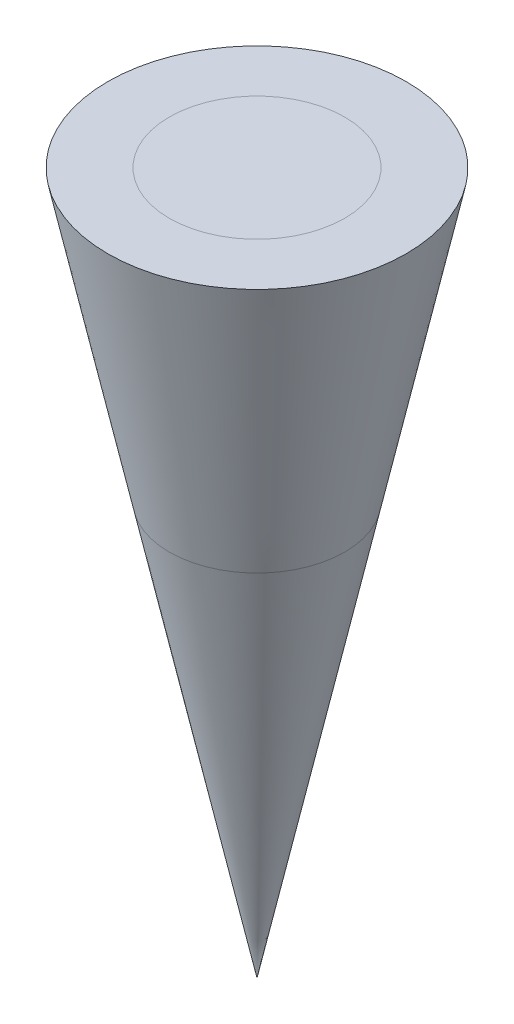
ISO-10303-21;
HEADER;
FILE_DESCRIPTION(('STEP AP214'),'2;1');
FILE_NAME('part.step','',(''),(''),'','','');
FILE_SCHEMA(('AUTOMOTIVE_DESIGN { 1 0 10303 214 1 1 1 1 }'));
ENDSEC;
DATA;
#1=APPLICATION_CONTEXT('core data for automotive mechanical design processes');
#2=APPLICATION_PROTOCOL_DEFINITION('international standard','automotive_design',2000,#1);
#3=PRODUCT_CONTEXT('',#1,'mechanical');
#4=PRODUCT('Part','Part','',(#3));
#5=PRODUCT_RELATED_PRODUCT_CATEGORY('part','',(#4));
#6=PRODUCT_DEFINITION_FORMATION('','',#4);
#7=PRODUCT_DEFINITION_CONTEXT('part definition',#1,'design');
#8=PRODUCT_DEFINITION('design','',#6,#7);
#9=PRODUCT_DEFINITION_SHAPE('','',#8);
#10=(LENGTH_UNIT() NAMED_UNIT(*) SI_UNIT(.MILLI.,.METRE.));
#11=(NAMED_UNIT(*) PLANE_ANGLE_UNIT() SI_UNIT($,.RADIAN.));
#12=(NAMED_UNIT(*) SI_UNIT($,.STERADIAN.) SOLID_ANGLE_UNIT());
#13=UNCERTAINTY_MEASURE_WITH_UNIT(LENGTH_MEASURE(1.E-05),#10,'distance_accuracy_value','');
#14=(GEOMETRIC_REPRESENTATION_CONTEXT(3) GLOBAL_UNCERTAINTY_ASSIGNED_CONTEXT((#13)) GLOBAL_UNIT_ASSIGNED_CONTEXT((#10,
#11,#12)) REPRESENTATION_CONTEXT('',''));
#15=CARTESIAN_POINT('',(0.,0.,0.));
#16=DIRECTION('',(0.,0.,1.));
#17=DIRECTION('',(1.,0.,0.));
#18=AXIS2_PLACEMENT_3D('',#15,#16,#17);
#19=CARTESIAN_POINT('',(0.,-0.00999999999999959,0.));
#20=DIRECTION('',(0.,1.,0.));
#21=DIRECTION('',(0.,0.,1.));
#22=AXIS2_PLACEMENT_3D('',#19,#20,#21);
#23=CYLINDRICAL_SURFACE('',#22,1.25);
#24=CARTESIAN_POINT('',(0.,5.88078763684805,0.));
#25=DIRECTION('',(0.,1.,0.));
#26=DIRECTION('',(0.,0.,1.));
#27=AXIS2_PLACEMENT_3D('',#24,#25,#26);
#28=CIRCLE('',#27,1.25);
#29=CARTESIAN_POINT('',(0.,5.88078763684805,1.25));
#30=VERTEX_POINT('',#29);
#31=EDGE_CURVE('E57',#30,#30,#28,.F.);
#32=ORIENTED_EDGE('',*,*,#31,.F.);
#33=EDGE_LOOP('',(#32));
#34=FACE_BOUND('',#33,.T.);
#35=CARTESIAN_POINT('',(0.,10.,0.));
#36=DIRECTION('',(0.,1.,0.));
#37=DIRECTION('',(0.,0.,1.));
#38=AXIS2_PLACEMENT_3D('',#35,#36,#37);
#39=CIRCLE('',#38,1.25);
#40=CARTESIAN_POINT('',(0.,10.,1.25));
#41=VERTEX_POINT('',#40);
#42=EDGE_CURVE('E12',#41,#41,#39,.T.);
#43=ORIENTED_EDGE('',*,*,#42,.F.);
#44=EDGE_LOOP('',(#43));
#45=FACE_BOUND('',#44,.T.);
#46=ADVANCED_FACE('F53',(#34,#45),#23,.T.);
#47=CARTESIAN_POINT('',(0.,10.,0.));
#48=DIRECTION('',(0.,1.,0.));
#49=DIRECTION('',(0.,0.,1.));
#50=AXIS2_PLACEMENT_3D('',#47,#48,#49);
#51=PLANE('',#50);
#52=ORIENTED_EDGE('',*,*,#42,.T.);
#53=EDGE_LOOP('',(#52));
#54=FACE_BOUND('',#53,.T.);
#55=ADVANCED_FACE('F55',(#54),#51,.T.);
#56=CARTESIAN_POINT('',(0.,30.,0.));
#57=DIRECTION('',(0.,1.,0.));
#58=DIRECTION('',(0.,0.,1.));
#59=AXIS2_PLACEMENT_3D('',#56,#57,#58);
#60=CONICAL_SURFACE('',#59,6.37669685010068,0.20943951023932);
#61=ORIENTED_EDGE('',*,*,#31,.T.);
#62=EDGE_LOOP('',(#61));
#63=FACE_BOUND('',#62,.T.);
#64=CARTESIAN_POINT('',(0.,0.,0.));
#65=VERTEX_POINT('',#64);
#66=VERTEX_LOOP('',#65);
#67=FACE_BOUND('',#66,.T.);
#68=ADVANCED_FACE('F64',(#63,#67),#60,.T.);
#69=CLOSED_SHELL('',(#46,#55,#68));
#70=MANIFOLD_SOLID_BREP('B2',#69);
#71=CARTESIAN_POINT('',(0.,10.,0.));
#72=DIRECTION('',(0.,1.,0.));
#73=DIRECTION('',(0.,0.,1.));
#74=AXIS2_PLACEMENT_3D('',#71,#72,#73);
#75=PLANE('',#74);
#76=CARTESIAN_POINT('',(0.,10.,0.));
#77=DIRECTION('',(0.,1.,0.));
#78=DIRECTION('',(0.,0.,1.));
#79=AXIS2_PLACEMENT_3D('',#76,#77,#78);
#80=CIRCLE('',#79,1.25);
#81=CARTESIAN_POINT('',(0.,10.,1.25));
#82=VERTEX_POINT('',#81);
#83=EDGE_CURVE('E52',#82,#82,#80,.T.);
#84=ORIENTED_EDGE('',*,*,#83,.F.);
#85=EDGE_LOOP('',(#84));
#86=FACE_BOUND('',#85,.T.);
#87=CARTESIAN_POINT('',(0.,10.,0.));
#88=DIRECTION('',(0.,1.,0.));
#89=DIRECTION('',(0.,0.,1.));
#90=AXIS2_PLACEMENT_3D('',#87,#88,#89);
#91=CIRCLE('',#90,2.12556561670023);
#92=CARTESIAN_POINT('',(0.,10.,2.12556561670023));
#93=VERTEX_POINT('',#92);
#94=EDGE_CURVE('E125',#93,#93,#91,.F.);
#95=ORIENTED_EDGE('',*,*,#94,.F.);
#96=EDGE_LOOP('',(#95));
#97=FACE_BOUND('',#96,.T.);
#98=ADVANCED_FACE('F121',(#86,#97),#75,.T.);
#99=CARTESIAN_POINT('',(0.,-0.00999999999999959,0.));
#100=DIRECTION('',(0.,1.,0.));
#101=DIRECTION('',(0.,0.,1.));
#102=AXIS2_PLACEMENT_3D('',#99,#100,#101);
#103=CYLINDRICAL_SURFACE('',#102,1.25);
#104=CARTESIAN_POINT('',(0.,5.88078763684805,0.));
#105=DIRECTION('',(0.,1.,0.));
#106=DIRECTION('',(0.,0.,1.));
#107=AXIS2_PLACEMENT_3D('',#104,#105,#106);
#108=CIRCLE('',#107,1.25);
#109=CARTESIAN_POINT('',(0.,5.88078763684805,1.25));
#110=VERTEX_POINT('',#109);
#111=EDGE_CURVE('E129',#110,#110,#108,.F.);
#112=ORIENTED_EDGE('',*,*,#111,.T.);
#113=EDGE_LOOP('',(#112));
#114=FACE_BOUND('',#113,.T.);
#115=ORIENTED_EDGE('',*,*,#83,.T.);
#116=EDGE_LOOP('',(#115));
#117=FACE_BOUND('',#116,.T.);
#118=ADVANCED_FACE('F123',(#114,#117),#103,.F.);
#119=CARTESIAN_POINT('',(0.,30.,0.));
#120=DIRECTION('',(0.,1.,0.));
#121=DIRECTION('',(0.,0.,1.));
#122=AXIS2_PLACEMENT_3D('',#119,#120,#121);
#123=CONICAL_SURFACE('',#122,6.37669685010068,0.20943951023932);
#124=ORIENTED_EDGE('',*,*,#94,.T.);
#125=EDGE_LOOP('',(#124));
#126=FACE_BOUND('',#125,.T.);
#127=ORIENTED_EDGE('',*,*,#111,.F.);
#128=EDGE_LOOP('',(#127));
#129=FACE_BOUND('',#128,.T.);
#130=ADVANCED_FACE('F139',(#126,#129),#123,.T.);
#131=CLOSED_SHELL('',(#98,#118,#130));
#132=MANIFOLD_SOLID_BREP('B6',#131);
#133=ADVANCED_BREP_SHAPE_REPRESENTATION('',(#18,#70,#132),#14);
#134=SHAPE_DEFINITION_REPRESENTATION(#9,#133);
ENDSEC;
END-ISO-10303-21;
